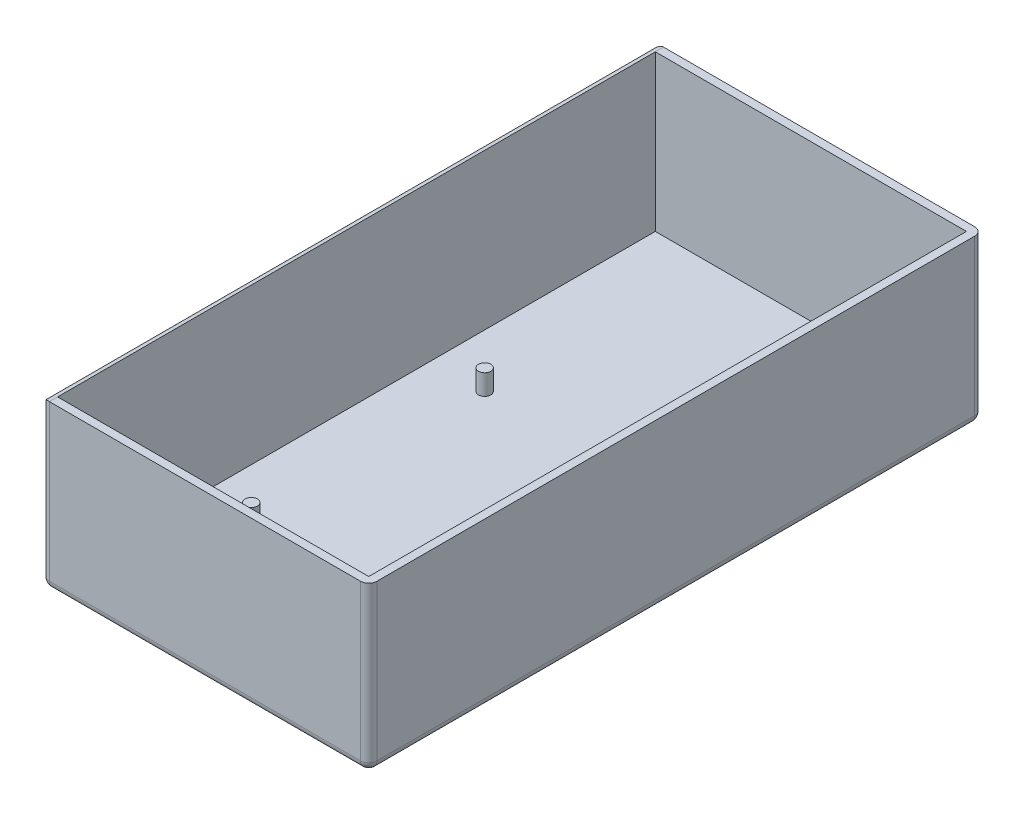
ISO-10303-21;
HEADER;
FILE_DESCRIPTION(('STEP AP214'),'2;1');
FILE_NAME('part.step','',(''),(''),'','','');
FILE_SCHEMA(('AUTOMOTIVE_DESIGN { 1 0 10303 214 1 1 1 1 }'));
ENDSEC;
DATA;
#1=APPLICATION_CONTEXT('core data for automotive mechanical design processes');
#2=APPLICATION_PROTOCOL_DEFINITION('international standard','automotive_design',2000,#1);
#3=PRODUCT_CONTEXT('',#1,'mechanical');
#4=PRODUCT('Part','Part','',(#3));
#5=PRODUCT_RELATED_PRODUCT_CATEGORY('part','',(#4));
#6=PRODUCT_DEFINITION_FORMATION('','',#4);
#7=PRODUCT_DEFINITION_CONTEXT('part definition',#1,'design');
#8=PRODUCT_DEFINITION('design','',#6,#7);
#9=PRODUCT_DEFINITION_SHAPE('','',#8);
#10=(LENGTH_UNIT() NAMED_UNIT(*) SI_UNIT(.MILLI.,.METRE.));
#11=(NAMED_UNIT(*) PLANE_ANGLE_UNIT() SI_UNIT($,.RADIAN.));
#12=(NAMED_UNIT(*) SI_UNIT($,.STERADIAN.) SOLID_ANGLE_UNIT());
#13=UNCERTAINTY_MEASURE_WITH_UNIT(LENGTH_MEASURE(1.E-05),#10,'distance_accuracy_value','');
#14=(GEOMETRIC_REPRESENTATION_CONTEXT(3) GLOBAL_UNCERTAINTY_ASSIGNED_CONTEXT((#13)) GLOBAL_UNIT_ASSIGNED_CONTEXT((#10,
#11,#12)) REPRESENTATION_CONTEXT('',''));
#15=CARTESIAN_POINT('',(0.,0.,0.));
#16=DIRECTION('',(0.,0.,1.));
#17=DIRECTION('',(1.,0.,0.));
#18=AXIS2_PLACEMENT_3D('',#15,#16,#17);
#19=CARTESIAN_POINT('',(-48.8659203302278,40.,-116.755152562222));
#20=DIRECTION('',(1.,0.,0.));
#21=DIRECTION('',(0.,0.,-1.));
#22=AXIS2_PLACEMENT_3D('',#19,#20,#21);
#23=PLANE('',#22);
#24=DIRECTION('',(0.,-1.,0.));
#25=VECTOR('',#24,1.);
#26=CARTESIAN_POINT('',(-48.8659203302278,40.,31.2448474377779));
#27=LINE('',#26,#25);
#28=CARTESIAN_POINT('',(-48.8659203302278,2.,31.2448474377779));
#29=VERTEX_POINT('',#28);
#30=CARTESIAN_POINT('',(-48.8659203302278,38.,31.2448474377779));
#31=VERTEX_POINT('',#30);
#32=EDGE_CURVE('E219',#29,#31,#27,.F.);
#33=ORIENTED_EDGE('',*,*,#32,.T.);
#34=DIRECTION('',(0.,0.,1.));
#35=VECTOR('',#34,1.);
#36=CARTESIAN_POINT('',(-48.8659203302278,38.,-116.755152562222));
#37=LINE('',#36,#35);
#38=CARTESIAN_POINT('',(-48.8659203302278,38.,-114.755152562222));
#39=VERTEX_POINT('',#38);
#40=EDGE_CURVE('E225',#31,#39,#37,.F.);
#41=ORIENTED_EDGE('',*,*,#40,.T.);
#42=DIRECTION('',(0.,-1.,0.));
#43=VECTOR('',#42,1.);
#44=CARTESIAN_POINT('',(-48.8659203302278,40.,-114.755152562222));
#45=LINE('',#44,#43);
#46=CARTESIAN_POINT('',(-48.8659203302278,2.,-114.755152562222));
#47=VERTEX_POINT('',#46);
#48=EDGE_CURVE('E223',#39,#47,#45,.T.);
#49=ORIENTED_EDGE('',*,*,#48,.T.);
#50=DIRECTION('',(0.,0.,1.));
#51=VECTOR('',#50,1.);
#52=CARTESIAN_POINT('',(-48.8659203302278,2.,-116.755152562222));
#53=LINE('',#52,#51);
#54=EDGE_CURVE('E221',#47,#29,#53,.T.);
#55=ORIENTED_EDGE('',*,*,#54,.T.);
#56=EDGE_LOOP('',(#33,#41,#49,#55));
#57=FACE_BOUND('',#56,.T.);
#58=ADVANCED_FACE('F33',(#57),#23,.F.);
#59=CARTESIAN_POINT('',(-48.8659203302278,40.,33.2448474377779));
#60=DIRECTION('',(0.,0.,-1.));
#61=DIRECTION('',(-1.,0.,0.));
#62=AXIS2_PLACEMENT_3D('',#59,#60,#61);
#63=PLANE('',#62);
#64=DIRECTION('',(1.,0.,0.));
#65=VECTOR('',#64,1.);
#66=CARTESIAN_POINT('',(-48.8659203302278,40.,33.2448474377779));
#67=LINE('',#66,#65);
#68=CARTESIAN_POINT('',(-46.8659203302278,40.,33.2448474377779));
#69=VERTEX_POINT('',#68);
#70=CARTESIAN_POINT('',(29.1340796697722,40.,33.2448474377779));
#71=VERTEX_POINT('',#70);
#72=EDGE_CURVE('E177',#69,#71,#67,.T.);
#73=ORIENTED_EDGE('',*,*,#72,.F.);
#74=DIRECTION('',(0.,-1.,0.));
#75=VECTOR('',#74,1.);
#76=CARTESIAN_POINT('',(-46.8659203302278,40.,33.2448474377779));
#77=LINE('',#76,#75);
#78=CARTESIAN_POINT('',(-46.8659203302278,2.,33.2448474377779));
#79=VERTEX_POINT('',#78);
#80=EDGE_CURVE('E11',#69,#79,#77,.T.);
#81=ORIENTED_EDGE('',*,*,#80,.T.);
#82=DIRECTION('',(1.,0.,0.));
#83=VECTOR('',#82,1.);
#84=CARTESIAN_POINT('',(-48.8659203302278,2.,33.2448474377779));
#85=LINE('',#84,#83);
#86=CARTESIAN_POINT('',(29.1340796697722,2.,33.2448474377779));
#87=VERTEX_POINT('',#86);
#88=EDGE_CURVE('E42',#79,#87,#85,.T.);
#89=ORIENTED_EDGE('',*,*,#88,.T.);
#90=DIRECTION('',(0.,-1.,0.));
#91=VECTOR('',#90,1.);
#92=CARTESIAN_POINT('',(29.1340796697722,40.,33.2448474377779));
#93=LINE('',#92,#91);
#94=EDGE_CURVE('E228',#87,#71,#93,.F.);
#95=ORIENTED_EDGE('',*,*,#94,.T.);
#96=EDGE_LOOP('',(#73,#81,#89,#95));
#97=FACE_BOUND('',#96,.T.);
#98=ADVANCED_FACE('F318',(#97),#63,.F.);
#99=CARTESIAN_POINT('',(31.1340796697722,40.,-116.755152562222));
#100=DIRECTION('',(-1.,0.,0.));
#101=DIRECTION('',(0.,0.,1.));
#102=AXIS2_PLACEMENT_3D('',#99,#100,#101);
#103=PLANE('',#102);
#104=DIRECTION('',(0.,0.,-1.));
#105=VECTOR('',#104,1.);
#106=CARTESIAN_POINT('',(31.1340796697722,2.,-116.755152562222));
#107=LINE('',#106,#105);
#108=CARTESIAN_POINT('',(31.1340796697722,2.,31.2448474377779));
#109=VERTEX_POINT('',#108);
#110=CARTESIAN_POINT('',(31.1340796697722,2.,-114.755152562222));
#111=VERTEX_POINT('',#110);
#112=EDGE_CURVE('E198',#109,#111,#107,.T.);
#113=ORIENTED_EDGE('',*,*,#112,.T.);
#114=DIRECTION('',(0.,-1.,0.));
#115=VECTOR('',#114,1.);
#116=CARTESIAN_POINT('',(31.1340796697722,40.,-114.755152562222));
#117=LINE('',#116,#115);
#118=CARTESIAN_POINT('',(31.1340796697722,40.,-114.755152562222));
#119=VERTEX_POINT('',#118);
#120=EDGE_CURVE('E200',#111,#119,#117,.F.);
#121=ORIENTED_EDGE('',*,*,#120,.T.);
#122=DIRECTION('',(0.,0.,-1.));
#123=VECTOR('',#122,1.);
#124=CARTESIAN_POINT('',(31.1340796697722,40.,-116.755152562222));
#125=LINE('',#124,#123);
#126=CARTESIAN_POINT('',(31.1340796697722,40.,31.2448474377779));
#127=VERTEX_POINT('',#126);
#128=EDGE_CURVE('E183',#127,#119,#125,.T.);
#129=ORIENTED_EDGE('',*,*,#128,.F.);
#130=DIRECTION('',(0.,-1.,0.));
#131=VECTOR('',#130,1.);
#132=CARTESIAN_POINT('',(31.1340796697722,40.,31.2448474377779));
#133=LINE('',#132,#131);
#134=EDGE_CURVE('E196',#127,#109,#133,.T.);
#135=ORIENTED_EDGE('',*,*,#134,.T.);
#136=EDGE_LOOP('',(#113,#121,#129,#135));
#137=FACE_BOUND('',#136,.T.);
#138=ADVANCED_FACE('F325',(#137),#103,.F.);
#139=CARTESIAN_POINT('',(-48.8659203302278,40.,-116.755152562222));
#140=DIRECTION('',(0.,0.,1.));
#141=DIRECTION('',(1.,0.,0.));
#142=AXIS2_PLACEMENT_3D('',#139,#140,#141);
#143=PLANE('',#142);
#144=DIRECTION('',(-1.,0.,0.));
#145=VECTOR('',#144,1.);
#146=CARTESIAN_POINT('',(-48.8659203302278,40.,-116.755152562222));
#147=LINE('',#146,#145);
#148=CARTESIAN_POINT('',(29.1340796697722,40.,-116.755152562222));
#149=VERTEX_POINT('',#148);
#150=CARTESIAN_POINT('',(-46.8659203302278,40.,-116.755152562222));
#151=VERTEX_POINT('',#150);
#152=EDGE_CURVE('E186',#149,#151,#147,.T.);
#153=ORIENTED_EDGE('',*,*,#152,.F.);
#154=DIRECTION('',(0.,-1.,0.));
#155=VECTOR('',#154,1.);
#156=CARTESIAN_POINT('',(29.1340796697722,40.,-116.755152562222));
#157=LINE('',#156,#155);
#158=CARTESIAN_POINT('',(29.1340796697722,2.,-116.755152562222));
#159=VERTEX_POINT('',#158);
#160=EDGE_CURVE('E193',#149,#159,#157,.T.);
#161=ORIENTED_EDGE('',*,*,#160,.T.);
#162=DIRECTION('',(-1.,0.,0.));
#163=VECTOR('',#162,1.);
#164=CARTESIAN_POINT('',(-48.8659203302278,2.,-116.755152562222));
#165=LINE('',#164,#163);
#166=CARTESIAN_POINT('',(-46.8659203302278,2.,-116.755152562222));
#167=VERTEX_POINT('',#166);
#168=EDGE_CURVE('E191',#159,#167,#165,.T.);
#169=ORIENTED_EDGE('',*,*,#168,.T.);
#170=DIRECTION('',(0.,-1.,0.));
#171=VECTOR('',#170,1.);
#172=CARTESIAN_POINT('',(-46.8659203302278,40.,-116.755152562222));
#173=LINE('',#172,#171);
#174=EDGE_CURVE('E189',#167,#151,#173,.F.);
#175=ORIENTED_EDGE('',*,*,#174,.T.);
#176=EDGE_LOOP('',(#153,#161,#169,#175));
#177=FACE_BOUND('',#176,.T.);
#178=ADVANCED_FACE('F399',(#177),#143,.F.);
#179=CARTESIAN_POINT('',(0.,40.,0.));
#180=DIRECTION('',(0.,1.,0.));
#181=DIRECTION('',(0.,0.,1.));
#182=AXIS2_PLACEMENT_3D('',#179,#180,#181);
#183=PLANE('',#182);
#184=ORIENTED_EDGE('',*,*,#128,.T.);
#185=CARTESIAN_POINT('',(29.1340796697722,40.,-114.755152562222));
#186=DIRECTION('',(0.,1.,0.));
#187=DIRECTION('',(0.,0.,1.));
#188=AXIS2_PLACEMENT_3D('',#185,#186,#187);
#189=CIRCLE('',#188,2.);
#190=EDGE_CURVE('E208',#119,#149,#189,.T.);
#191=ORIENTED_EDGE('',*,*,#190,.T.);
#192=ORIENTED_EDGE('',*,*,#152,.T.);
#193=DIRECTION('',(0.,0.,1.));
#194=VECTOR('',#193,1.);
#195=CARTESIAN_POINT('',(-46.8659203302278,40.,33.2448474377779));
#196=LINE('',#195,#194);
#197=CARTESIAN_POINT('',(-46.8659203302278,40.,-114.755152562222));
#198=VERTEX_POINT('',#197);
#199=EDGE_CURVE('E206',#151,#198,#196,.T.);
#200=ORIENTED_EDGE('',*,*,#199,.T.);
#201=DIRECTION('',(-1.,0.,0.));
#202=VECTOR('',#201,1.);
#203=CARTESIAN_POINT('',(-46.8659203302278,40.,-114.755152562222));
#204=LINE('',#203,#202);
#205=CARTESIAN_POINT('',(29.1340796697722,40.,-114.755152562222));
#206=VERTEX_POINT('',#205);
#207=EDGE_CURVE('E170',#206,#198,#204,.T.);
#208=ORIENTED_EDGE('',*,*,#207,.F.);
#209=DIRECTION('',(0.,0.,-1.));
#210=VECTOR('',#209,1.);
#211=CARTESIAN_POINT('',(29.1340796697722,40.,-114.755152562222));
#212=LINE('',#211,#210);
#213=CARTESIAN_POINT('',(29.1340796697722,40.,31.2448474377779));
#214=VERTEX_POINT('',#213);
#215=EDGE_CURVE('E140',#214,#206,#212,.T.);
#216=ORIENTED_EDGE('',*,*,#215,.F.);
#217=DIRECTION('',(1.,0.,0.));
#218=VECTOR('',#217,1.);
#219=CARTESIAN_POINT('',(-46.8659203302278,40.,31.2448474377779));
#220=LINE('',#219,#218);
#221=CARTESIAN_POINT('',(-46.8659203302278,40.,31.2448474377779));
#222=VERTEX_POINT('',#221);
#223=EDGE_CURVE('E158',#222,#214,#220,.T.);
#224=ORIENTED_EDGE('',*,*,#223,.F.);
#225=DIRECTION('',(0.,0.,1.));
#226=VECTOR('',#225,1.);
#227=CARTESIAN_POINT('',(-46.8659203302278,40.,33.2448474377779));
#228=LINE('',#227,#226);
#229=EDGE_CURVE('E204',#222,#69,#228,.T.);
#230=ORIENTED_EDGE('',*,*,#229,.T.);
#231=ORIENTED_EDGE('',*,*,#72,.T.);
#232=CARTESIAN_POINT('',(29.1340796697722,40.,31.2448474377779));
#233=DIRECTION('',(0.,1.,0.));
#234=DIRECTION('',(0.,0.,1.));
#235=AXIS2_PLACEMENT_3D('',#232,#233,#234);
#236=CIRCLE('',#235,2.);
#237=EDGE_CURVE('E202',#71,#127,#236,.T.);
#238=ORIENTED_EDGE('',*,*,#237,.T.);
#239=EDGE_LOOP('',(#184,#191,#192,#200,#208,#216,#224,#230,#231,#238));
#240=FACE_BOUND('',#239,.T.);
#241=ADVANCED_FACE('F384',(#240),#183,.T.);
#242=CARTESIAN_POINT('',(0.,0.,0.));
#243=DIRECTION('',(0.,1.,0.));
#244=DIRECTION('',(0.,0.,1.));
#245=AXIS2_PLACEMENT_3D('',#242,#243,#244);
#246=PLANE('',#245);
#247=DIRECTION('',(-1.,0.,0.));
#248=VECTOR('',#247,1.);
#249=CARTESIAN_POINT('',(0.,0.,-114.755152562222));
#250=LINE('',#249,#248);
#251=CARTESIAN_POINT('',(-46.8659203302278,0.,-114.755152562222));
#252=VERTEX_POINT('',#251);
#253=CARTESIAN_POINT('',(29.1340796697722,0.,-114.755152562222));
#254=VERTEX_POINT('',#253);
#255=EDGE_CURVE('E214',#252,#254,#250,.F.);
#256=ORIENTED_EDGE('',*,*,#255,.T.);
#257=DIRECTION('',(0.,0.,-1.));
#258=VECTOR('',#257,1.);
#259=CARTESIAN_POINT('',(29.1340796697722,0.,0.));
#260=LINE('',#259,#258);
#261=CARTESIAN_POINT('',(29.1340796697722,0.,31.2448474377779));
#262=VERTEX_POINT('',#261);
#263=EDGE_CURVE('E216',#254,#262,#260,.F.);
#264=ORIENTED_EDGE('',*,*,#263,.T.);
#265=DIRECTION('',(1.,0.,0.));
#266=VECTOR('',#265,1.);
#267=CARTESIAN_POINT('',(0.,0.,31.2448474377779));
#268=LINE('',#267,#266);
#269=CARTESIAN_POINT('',(-46.8659203302278,0.,31.2448474377779));
#270=VERTEX_POINT('',#269);
#271=EDGE_CURVE('E210',#262,#270,#268,.F.);
#272=ORIENTED_EDGE('',*,*,#271,.T.);
#273=DIRECTION('',(0.,0.,1.));
#274=VECTOR('',#273,1.);
#275=CARTESIAN_POINT('',(-46.8659203302278,0.,0.));
#276=LINE('',#275,#274);
#277=EDGE_CURVE('E212',#270,#252,#276,.F.);
#278=ORIENTED_EDGE('',*,*,#277,.T.);
#279=EDGE_LOOP('',(#256,#264,#272,#278));
#280=FACE_BOUND('',#279,.T.);
#281=ADVANCED_FACE('F394',(#280),#246,.F.);
#282=CARTESIAN_POINT('',(29.1340796697722,2.,-114.755152562222));
#283=DIRECTION('',(1.,0.,0.));
#284=DIRECTION('',(0.,0.,-1.));
#285=AXIS2_PLACEMENT_3D('',#282,#283,#284);
#286=PLANE('',#285);
#287=ORIENTED_EDGE('',*,*,#215,.T.);
#288=DIRECTION('',(0.,1.,0.));
#289=VECTOR('',#288,1.);
#290=CARTESIAN_POINT('',(29.1340796697722,2.,-114.755152562222));
#291=LINE('',#290,#289);
#292=CARTESIAN_POINT('',(29.1340796697722,2.,-114.755152562222));
#293=VERTEX_POINT('',#292);
#294=EDGE_CURVE('E133',#293,#206,#291,.T.);
#295=ORIENTED_EDGE('',*,*,#294,.F.);
#296=DIRECTION('',(0.,0.,-1.));
#297=VECTOR('',#296,1.);
#298=CARTESIAN_POINT('',(29.1340796697722,2.,-114.755152562222));
#299=LINE('',#298,#297);
#300=CARTESIAN_POINT('',(29.1340796697722,2.,31.2448474377779));
#301=VERTEX_POINT('',#300);
#302=EDGE_CURVE('E137',#301,#293,#299,.T.);
#303=ORIENTED_EDGE('',*,*,#302,.F.);
#304=DIRECTION('',(0.,1.,0.));
#305=VECTOR('',#304,1.);
#306=CARTESIAN_POINT('',(29.1340796697722,2.,31.2448474377779));
#307=LINE('',#306,#305);
#308=EDGE_CURVE('E175',#301,#214,#307,.T.);
#309=ORIENTED_EDGE('',*,*,#308,.T.);
#310=EDGE_LOOP('',(#287,#295,#303,#309));
#311=FACE_BOUND('',#310,.T.);
#312=ADVANCED_FACE('F135',(#311),#286,.F.);
#313=CARTESIAN_POINT('',(-46.8659203302278,2.,31.2448474377779));
#314=DIRECTION('',(0.,0.,1.));
#315=DIRECTION('',(1.,0.,0.));
#316=AXIS2_PLACEMENT_3D('',#313,#314,#315);
#317=PLANE('',#316);
#318=ORIENTED_EDGE('',*,*,#223,.T.);
#319=ORIENTED_EDGE('',*,*,#308,.F.);
#320=DIRECTION('',(1.,0.,0.));
#321=VECTOR('',#320,1.);
#322=CARTESIAN_POINT('',(-46.8659203302278,2.,31.2448474377779));
#323=LINE('',#322,#321);
#324=CARTESIAN_POINT('',(-46.8659203302278,2.,31.2448474377779));
#325=VERTEX_POINT('',#324);
#326=EDGE_CURVE('E145',#325,#301,#323,.T.);
#327=ORIENTED_EDGE('',*,*,#326,.F.);
#328=DIRECTION('',(0.,1.,0.));
#329=VECTOR('',#328,1.);
#330=CARTESIAN_POINT('',(-46.8659203302278,2.,31.2448474377779));
#331=LINE('',#330,#329);
#332=EDGE_CURVE('E178',#325,#222,#331,.T.);
#333=ORIENTED_EDGE('',*,*,#332,.T.);
#334=EDGE_LOOP('',(#318,#319,#327,#333));
#335=FACE_BOUND('',#334,.T.);
#336=ADVANCED_FACE('F386',(#335),#317,.F.);
#337=CARTESIAN_POINT('',(-46.8659203302278,2.,-114.755152562222));
#338=DIRECTION('',(-1.,0.,0.));
#339=DIRECTION('',(0.,0.,1.));
#340=AXIS2_PLACEMENT_3D('',#337,#338,#339);
#341=PLANE('',#340);
#342=DIRECTION('',(0.,0.,1.));
#343=VECTOR('',#342,1.);
#344=CARTESIAN_POINT('',(-46.8659203302278,40.,-114.755152562222));
#345=LINE('',#344,#343);
#346=EDGE_CURVE('E161',#198,#222,#345,.T.);
#347=ORIENTED_EDGE('',*,*,#346,.T.);
#348=ORIENTED_EDGE('',*,*,#332,.F.);
#349=DIRECTION('',(0.,0.,1.));
#350=VECTOR('',#349,1.);
#351=CARTESIAN_POINT('',(-46.8659203302278,2.,-114.755152562222));
#352=LINE('',#351,#350);
#353=CARTESIAN_POINT('',(-46.8659203302278,2.,-114.755152562222));
#354=VERTEX_POINT('',#353);
#355=EDGE_CURVE('E154',#354,#325,#352,.T.);
#356=ORIENTED_EDGE('',*,*,#355,.F.);
#357=DIRECTION('',(0.,1.,0.));
#358=VECTOR('',#357,1.);
#359=CARTESIAN_POINT('',(-46.8659203302278,2.,-114.755152562222));
#360=LINE('',#359,#358);
#361=EDGE_CURVE('E144',#354,#198,#360,.T.);
#362=ORIENTED_EDGE('',*,*,#361,.T.);
#363=EDGE_LOOP('',(#347,#348,#356,#362));
#364=FACE_BOUND('',#363,.T.);
#365=ADVANCED_FACE('F313',(#364),#341,.F.);
#366=CARTESIAN_POINT('',(-46.8659203302278,2.,-114.755152562222));
#367=DIRECTION('',(0.,0.,-1.));
#368=DIRECTION('',(-1.,0.,0.));
#369=AXIS2_PLACEMENT_3D('',#366,#367,#368);
#370=PLANE('',#369);
#371=ORIENTED_EDGE('',*,*,#207,.T.);
#372=ORIENTED_EDGE('',*,*,#361,.F.);
#373=DIRECTION('',(-1.,0.,0.));
#374=VECTOR('',#373,1.);
#375=CARTESIAN_POINT('',(-46.8659203302278,2.,-114.755152562222));
#376=LINE('',#375,#374);
#377=EDGE_CURVE('E148',#293,#354,#376,.T.);
#378=ORIENTED_EDGE('',*,*,#377,.F.);
#379=ORIENTED_EDGE('',*,*,#294,.T.);
#380=EDGE_LOOP('',(#371,#372,#378,#379));
#381=FACE_BOUND('',#380,.T.);
#382=ADVANCED_FACE('F149',(#381),#370,.F.);
#383=CARTESIAN_POINT('',(0.,2.,0.));
#384=DIRECTION('',(0.,1.,0.));
#385=DIRECTION('',(0.,0.,1.));
#386=AXIS2_PLACEMENT_3D('',#383,#384,#385);
#387=PLANE('',#386);
#388=CARTESIAN_POINT('',(-33.8659203302278,2.,-3.07233878495181));
#389=DIRECTION('',(0.,1.,0.));
#390=DIRECTION('',(0.,0.,1.));
#391=AXIS2_PLACEMENT_3D('',#388,#389,#390);
#392=CIRCLE('',#391,1.5);
#393=CARTESIAN_POINT('',(-33.8659203302278,2.,-1.5723387849518));
#394=VERTEX_POINT('',#393);
#395=EDGE_CURVE('E270',#394,#394,#392,.T.);
#396=ORIENTED_EDGE('',*,*,#395,.F.);
#397=EDGE_LOOP('',(#396));
#398=FACE_BOUND('',#397,.T.);
#399=CARTESIAN_POINT('',(16.1340796697722,2.,-3.07233878495181));
#400=DIRECTION('',(0.,1.,0.));
#401=DIRECTION('',(0.,0.,-1.));
#402=AXIS2_PLACEMENT_3D('',#399,#400,#401);
#403=CIRCLE('',#402,1.5);
#404=CARTESIAN_POINT('',(16.1340796697722,2.,-4.57233878495181));
#405=VERTEX_POINT('',#404);
#406=EDGE_CURVE('E281',#405,#405,#403,.T.);
#407=ORIENTED_EDGE('',*,*,#406,.F.);
#408=EDGE_LOOP('',(#407));
#409=FACE_BOUND('',#408,.T.);
#410=CARTESIAN_POINT('',(16.1340796697722,2.,-60.0723387849518));
#411=DIRECTION('',(0.,1.,0.));
#412=DIRECTION('',(0.,0.,-1.));
#413=AXIS2_PLACEMENT_3D('',#410,#411,#412);
#414=CIRCLE('',#413,1.5);
#415=CARTESIAN_POINT('',(16.1340796697722,2.,-61.5723387849518));
#416=VERTEX_POINT('',#415);
#417=EDGE_CURVE('E287',#416,#416,#414,.T.);
#418=ORIENTED_EDGE('',*,*,#417,.F.);
#419=EDGE_LOOP('',(#418));
#420=FACE_BOUND('',#419,.T.);
#421=CARTESIAN_POINT('',(-33.8659203302278,2.,-60.0723387849518));
#422=DIRECTION('',(0.,1.,0.));
#423=DIRECTION('',(0.,0.,1.));
#424=AXIS2_PLACEMENT_3D('',#421,#422,#423);
#425=CIRCLE('',#424,1.5);
#426=CARTESIAN_POINT('',(-33.8659203302278,2.,-58.5723387849518));
#427=VERTEX_POINT('',#426);
#428=EDGE_CURVE('E164',#427,#427,#425,.T.);
#429=ORIENTED_EDGE('',*,*,#428,.F.);
#430=EDGE_LOOP('',(#429));
#431=FACE_BOUND('',#430,.T.);
#432=ORIENTED_EDGE('',*,*,#302,.T.);
#433=ORIENTED_EDGE('',*,*,#377,.T.);
#434=ORIENTED_EDGE('',*,*,#355,.T.);
#435=ORIENTED_EDGE('',*,*,#326,.T.);
#436=EDGE_LOOP('',(#432,#433,#434,#435));
#437=FACE_BOUND('',#436,.T.);
#438=ADVANCED_FACE('F156',(#398,#409,#420,#431,#437),#387,.T.);
#439=CARTESIAN_POINT('',(-33.8659203302278,7.,-60.0723387849518));
#440=DIRECTION('',(0.,-1.,0.));
#441=DIRECTION('',(0.,0.,-1.));
#442=AXIS2_PLACEMENT_3D('',#439,#440,#441);
#443=CYLINDRICAL_SURFACE('',#442,1.5);
#444=CARTESIAN_POINT('',(-33.8659203302278,7.,-60.0723387849518));
#445=DIRECTION('',(0.,1.,0.));
#446=DIRECTION('',(0.,0.,1.));
#447=AXIS2_PLACEMENT_3D('',#444,#445,#446);
#448=CIRCLE('',#447,1.5);
#449=CARTESIAN_POINT('',(-33.8659203302278,7.,-58.5723387849518));
#450=VERTEX_POINT('',#449);
#451=EDGE_CURVE('E171',#450,#450,#448,.T.);
#452=ORIENTED_EDGE('',*,*,#451,.F.);
#453=EDGE_LOOP('',(#452));
#454=FACE_BOUND('',#453,.T.);
#455=ORIENTED_EDGE('',*,*,#428,.T.);
#456=EDGE_LOOP('',(#455));
#457=FACE_BOUND('',#456,.T.);
#458=ADVANCED_FACE('F300',(#454,#457),#443,.T.);
#459=CARTESIAN_POINT('',(-33.8659203302278,7.,-60.0723387849518));
#460=DIRECTION('',(0.,1.,0.));
#461=DIRECTION('',(0.,0.,1.));
#462=AXIS2_PLACEMENT_3D('',#459,#460,#461);
#463=PLANE('',#462);
#464=ORIENTED_EDGE('',*,*,#451,.T.);
#465=EDGE_LOOP('',(#464));
#466=FACE_BOUND('',#465,.T.);
#467=ADVANCED_FACE('F309',(#466),#463,.T.);
#468=CARTESIAN_POINT('',(16.1340796697722,7.,-60.0723387849518));
#469=DIRECTION('',(0.,-1.,0.));
#470=DIRECTION('',(0.,0.,-1.));
#471=AXIS2_PLACEMENT_3D('',#468,#469,#470);
#472=CYLINDRICAL_SURFACE('',#471,1.5);
#473=CARTESIAN_POINT('',(16.1340796697722,7.,-60.0723387849518));
#474=DIRECTION('',(0.,1.,0.));
#475=DIRECTION('',(0.,0.,-1.));
#476=AXIS2_PLACEMENT_3D('',#473,#474,#475);
#477=CIRCLE('',#476,1.5);
#478=CARTESIAN_POINT('',(16.1340796697722,7.,-61.5723387849518));
#479=VERTEX_POINT('',#478);
#480=EDGE_CURVE('E290',#479,#479,#477,.T.);
#481=ORIENTED_EDGE('',*,*,#480,.F.);
#482=EDGE_LOOP('',(#481));
#483=FACE_BOUND('',#482,.T.);
#484=ORIENTED_EDGE('',*,*,#417,.T.);
#485=EDGE_LOOP('',(#484));
#486=FACE_BOUND('',#485,.T.);
#487=ADVANCED_FACE('F582',(#483,#486),#472,.T.);
#488=CARTESIAN_POINT('',(16.1340796697722,7.,-60.0723387849518));
#489=DIRECTION('',(0.,-1.,0.));
#490=DIRECTION('',(0.,0.,-1.));
#491=AXIS2_PLACEMENT_3D('',#488,#489,#490);
#492=PLANE('',#491);
#493=ORIENTED_EDGE('',*,*,#480,.T.);
#494=EDGE_LOOP('',(#493));
#495=FACE_BOUND('',#494,.T.);
#496=ADVANCED_FACE('F574',(#495),#492,.F.);
#497=CARTESIAN_POINT('',(16.1340796697722,7.,-3.07233878495181));
#498=DIRECTION('',(0.,-1.,0.));
#499=DIRECTION('',(0.,0.,-1.));
#500=AXIS2_PLACEMENT_3D('',#497,#498,#499);
#501=CYLINDRICAL_SURFACE('',#500,1.5);
#502=CARTESIAN_POINT('',(16.1340796697722,7.,-3.07233878495181));
#503=DIRECTION('',(0.,1.,0.));
#504=DIRECTION('',(0.,0.,-1.));
#505=AXIS2_PLACEMENT_3D('',#502,#503,#504);
#506=CIRCLE('',#505,1.5);
#507=CARTESIAN_POINT('',(16.1340796697722,7.,-4.57233878495181));
#508=VERTEX_POINT('',#507);
#509=EDGE_CURVE('E284',#508,#508,#506,.T.);
#510=ORIENTED_EDGE('',*,*,#509,.F.);
#511=EDGE_LOOP('',(#510));
#512=FACE_BOUND('',#511,.T.);
#513=ORIENTED_EDGE('',*,*,#406,.T.);
#514=EDGE_LOOP('',(#513));
#515=FACE_BOUND('',#514,.T.);
#516=ADVANCED_FACE('F566',(#512,#515),#501,.T.);
#517=CARTESIAN_POINT('',(16.1340796697722,7.,-3.07233878495181));
#518=DIRECTION('',(0.,-1.,0.));
#519=DIRECTION('',(0.,0.,-1.));
#520=AXIS2_PLACEMENT_3D('',#517,#518,#519);
#521=PLANE('',#520);
#522=ORIENTED_EDGE('',*,*,#509,.T.);
#523=EDGE_LOOP('',(#522));
#524=FACE_BOUND('',#523,.T.);
#525=ADVANCED_FACE('F558',(#524),#521,.F.);
#526=CARTESIAN_POINT('',(-33.8659203302278,7.,-3.07233878495181));
#527=DIRECTION('',(0.,-1.,0.));
#528=DIRECTION('',(0.,0.,-1.));
#529=AXIS2_PLACEMENT_3D('',#526,#527,#528);
#530=CYLINDRICAL_SURFACE('',#529,1.5);
#531=CARTESIAN_POINT('',(-33.8659203302278,7.,-3.07233878495181));
#532=DIRECTION('',(0.,1.,0.));
#533=DIRECTION('',(0.,0.,1.));
#534=AXIS2_PLACEMENT_3D('',#531,#532,#533);
#535=CIRCLE('',#534,1.5);
#536=CARTESIAN_POINT('',(-33.8659203302278,7.,-1.5723387849518));
#537=VERTEX_POINT('',#536);
#538=EDGE_CURVE('E276',#537,#537,#535,.T.);
#539=ORIENTED_EDGE('',*,*,#538,.F.);
#540=EDGE_LOOP('',(#539));
#541=FACE_BOUND('',#540,.T.);
#542=ORIENTED_EDGE('',*,*,#395,.T.);
#543=EDGE_LOOP('',(#542));
#544=FACE_BOUND('',#543,.T.);
#545=ADVANCED_FACE('F551',(#541,#544),#530,.T.);
#546=CARTESIAN_POINT('',(-33.8659203302278,7.,-3.07233878495181));
#547=DIRECTION('',(0.,1.,0.));
#548=DIRECTION('',(0.,0.,1.));
#549=AXIS2_PLACEMENT_3D('',#546,#547,#548);
#550=PLANE('',#549);
#551=ORIENTED_EDGE('',*,*,#538,.T.);
#552=EDGE_LOOP('',(#551));
#553=FACE_BOUND('',#552,.T.);
#554=ADVANCED_FACE('F376',(#553),#550,.T.);
#555=CARTESIAN_POINT('',(-46.8659203302278,40.,31.2448474377779));
#556=DIRECTION('',(0.,-1.,0.));
#557=DIRECTION('',(0.,0.,-1.));
#558=AXIS2_PLACEMENT_3D('',#555,#556,#557);
#559=CYLINDRICAL_SURFACE('',#558,2.);
#560=CARTESIAN_POINT('',(-46.8659203302278,2.,31.2448474377779));
#561=DIRECTION('',(0.,-1.,0.));
#562=DIRECTION('',(0.,0.,-1.));
#563=AXIS2_PLACEMENT_3D('',#560,#561,#562);
#564=CIRCLE('',#563,2.);
#565=EDGE_CURVE('E264',#79,#29,#564,.T.);
#566=ORIENTED_EDGE('',*,*,#565,.F.);
#567=ORIENTED_EDGE('',*,*,#80,.F.);
#568=CARTESIAN_POINT('',(-46.8659203302278,38.,31.2448474377779));
#569=DIRECTION('',(0.,-0.707106781186547,0.707106781186547));
#570=DIRECTION('',(0.,-0.707106781186547,-0.707106781186547));
#571=AXIS2_PLACEMENT_3D('',#568,#569,#570);
#572=ELLIPSE('',#571,2.82842712474619,2.);
#573=EDGE_CURVE('E37',#31,#69,#572,.F.);
#574=ORIENTED_EDGE('',*,*,#573,.F.);
#575=ORIENTED_EDGE('',*,*,#32,.F.);
#576=EDGE_LOOP('',(#566,#567,#574,#575));
#577=FACE_BOUND('',#576,.T.);
#578=ADVANCED_FACE('F35',(#577),#559,.T.);
#579=CARTESIAN_POINT('',(-46.8659203302278,38.,0.));
#580=DIRECTION('',(0.,0.,-1.));
#581=DIRECTION('',(-1.,0.,0.));
#582=AXIS2_PLACEMENT_3D('',#579,#580,#581);
#583=CYLINDRICAL_SURFACE('',#582,2.);
#584=ORIENTED_EDGE('',*,*,#346,.F.);
#585=ORIENTED_EDGE('',*,*,#199,.F.);
#586=CARTESIAN_POINT('',(-46.8659203302278,38.,-114.755152562222));
#587=DIRECTION('',(0.,-0.707106781186547,-0.707106781186547));
#588=DIRECTION('',(0.,-0.707106781186547,0.707106781186547));
#589=AXIS2_PLACEMENT_3D('',#586,#587,#588);
#590=ELLIPSE('',#589,2.82842712474619,2.);
#591=EDGE_CURVE('E262',#39,#151,#590,.T.);
#592=ORIENTED_EDGE('',*,*,#591,.F.);
#593=ORIENTED_EDGE('',*,*,#40,.F.);
#594=ORIENTED_EDGE('',*,*,#573,.T.);
#595=ORIENTED_EDGE('',*,*,#229,.F.);
#596=EDGE_LOOP('',(#584,#585,#592,#593,#594,#595));
#597=FACE_BOUND('',#596,.T.);
#598=ADVANCED_FACE('F371',(#597),#583,.T.);
#599=CARTESIAN_POINT('',(-46.8659203302278,2.,31.2448474377779));
#600=DIRECTION('',(0.,0.,1.));
#601=DIRECTION('',(1.,0.,0.));
#602=AXIS2_PLACEMENT_3D('',#599,#600,#601);
#603=SPHERICAL_SURFACE('',#602,2.);
#604=CARTESIAN_POINT('',(-46.8659203302278,2.,31.2448474377779));
#605=DIRECTION('',(-1.,0.,0.));
#606=DIRECTION('',(0.,0.,1.));
#607=AXIS2_PLACEMENT_3D('',#604,#605,#606);
#608=CIRCLE('',#607,2.);
#609=EDGE_CURVE('E256',#79,#270,#608,.F.);
#610=ORIENTED_EDGE('',*,*,#609,.F.);
#611=ORIENTED_EDGE('',*,*,#565,.T.);
#612=CARTESIAN_POINT('',(-46.8659203302278,2.,31.2448474377779));
#613=DIRECTION('',(0.,0.,1.));
#614=DIRECTION('',(1.,0.,0.));
#615=AXIS2_PLACEMENT_3D('',#612,#613,#614);
#616=CIRCLE('',#615,2.);
#617=EDGE_CURVE('E259',#270,#29,#616,.F.);
#618=ORIENTED_EDGE('',*,*,#617,.F.);
#619=EDGE_LOOP('',(#610,#611,#618));
#620=FACE_BOUND('',#619,.T.);
#621=ADVANCED_FACE('F368',(#620),#603,.T.);
#622=CARTESIAN_POINT('',(-46.8659203302278,40.,-114.755152562222));
#623=DIRECTION('',(0.,-1.,0.));
#624=DIRECTION('',(0.,0.,-1.));
#625=AXIS2_PLACEMENT_3D('',#622,#623,#624);
#626=CYLINDRICAL_SURFACE('',#625,2.);
#627=ORIENTED_EDGE('',*,*,#591,.T.);
#628=ORIENTED_EDGE('',*,*,#174,.F.);
#629=CARTESIAN_POINT('',(-46.8659203302278,2.,-114.755152562222));
#630=DIRECTION('',(0.,-1.,0.));
#631=DIRECTION('',(0.,0.,-1.));
#632=AXIS2_PLACEMENT_3D('',#629,#630,#631);
#633=CIRCLE('',#632,2.);
#634=EDGE_CURVE('E253',#47,#167,#633,.T.);
#635=ORIENTED_EDGE('',*,*,#634,.F.);
#636=ORIENTED_EDGE('',*,*,#48,.F.);
#637=EDGE_LOOP('',(#627,#628,#635,#636));
#638=FACE_BOUND('',#637,.T.);
#639=ADVANCED_FACE('F364',(#638),#626,.T.);
#640=CARTESIAN_POINT('',(-46.8659203302278,2.,-116.755152562222));
#641=DIRECTION('',(0.,0.,1.));
#642=DIRECTION('',(1.,0.,0.));
#643=AXIS2_PLACEMENT_3D('',#640,#641,#642);
#644=CYLINDRICAL_SURFACE('',#643,2.);
#645=ORIENTED_EDGE('',*,*,#617,.T.);
#646=ORIENTED_EDGE('',*,*,#54,.F.);
#647=CARTESIAN_POINT('',(-46.8659203302278,2.,-114.755152562222));
#648=DIRECTION('',(0.,0.,-1.));
#649=DIRECTION('',(-1.,0.,0.));
#650=AXIS2_PLACEMENT_3D('',#647,#648,#649);
#651=CIRCLE('',#650,2.);
#652=EDGE_CURVE('E250',#252,#47,#651,.T.);
#653=ORIENTED_EDGE('',*,*,#652,.F.);
#654=ORIENTED_EDGE('',*,*,#277,.F.);
#655=EDGE_LOOP('',(#645,#646,#653,#654));
#656=FACE_BOUND('',#655,.T.);
#657=ADVANCED_FACE('F360',(#656),#644,.T.);
#658=CARTESIAN_POINT('',(-48.8659203302278,2.,31.2448474377779));
#659=DIRECTION('',(1.,0.,0.));
#660=DIRECTION('',(0.,0.,-1.));
#661=AXIS2_PLACEMENT_3D('',#658,#659,#660);
#662=CYLINDRICAL_SURFACE('',#661,2.);
#663=ORIENTED_EDGE('',*,*,#609,.T.);
#664=ORIENTED_EDGE('',*,*,#271,.F.);
#665=CARTESIAN_POINT('',(29.1340796697722,2.,31.2448474377779));
#666=DIRECTION('',(1.,0.,0.));
#667=DIRECTION('',(0.,0.,-1.));
#668=AXIS2_PLACEMENT_3D('',#665,#666,#667);
#669=CIRCLE('',#668,2.);
#670=EDGE_CURVE('E247',#87,#262,#669,.T.);
#671=ORIENTED_EDGE('',*,*,#670,.F.);
#672=ORIENTED_EDGE('',*,*,#88,.F.);
#673=EDGE_LOOP('',(#663,#664,#671,#672));
#674=FACE_BOUND('',#673,.T.);
#675=ADVANCED_FACE('F356',(#674),#662,.T.);
#676=CARTESIAN_POINT('',(29.1340796697722,40.,31.2448474377779));
#677=DIRECTION('',(0.,-1.,0.));
#678=DIRECTION('',(0.,0.,-1.));
#679=AXIS2_PLACEMENT_3D('',#676,#677,#678);
#680=CYLINDRICAL_SURFACE('',#679,2.);
#681=ORIENTED_EDGE('',*,*,#237,.F.);
#682=ORIENTED_EDGE('',*,*,#94,.F.);
#683=CARTESIAN_POINT('',(29.1340796697722,2.,31.2448474377779));
#684=DIRECTION('',(0.,-1.,0.));
#685=DIRECTION('',(0.,0.,-1.));
#686=AXIS2_PLACEMENT_3D('',#683,#684,#685);
#687=CIRCLE('',#686,2.);
#688=EDGE_CURVE('E244',#109,#87,#687,.T.);
#689=ORIENTED_EDGE('',*,*,#688,.F.);
#690=ORIENTED_EDGE('',*,*,#134,.F.);
#691=EDGE_LOOP('',(#681,#682,#689,#690));
#692=FACE_BOUND('',#691,.T.);
#693=ADVANCED_FACE('F352',(#692),#680,.T.);
#694=CARTESIAN_POINT('',(-46.8659203302278,2.,-114.755152562222));
#695=DIRECTION('',(0.,0.,1.));
#696=DIRECTION('',(1.,0.,0.));
#697=AXIS2_PLACEMENT_3D('',#694,#695,#696);
#698=SPHERICAL_SURFACE('',#697,2.);
#699=ORIENTED_EDGE('',*,*,#652,.T.);
#700=ORIENTED_EDGE('',*,*,#634,.T.);
#701=CARTESIAN_POINT('',(-46.8659203302278,2.,-114.755152562222));
#702=DIRECTION('',(-1.,0.,0.));
#703=DIRECTION('',(0.,0.,1.));
#704=AXIS2_PLACEMENT_3D('',#701,#702,#703);
#705=CIRCLE('',#704,2.);
#706=EDGE_CURVE('E241',#252,#167,#705,.F.);
#707=ORIENTED_EDGE('',*,*,#706,.F.);
#708=EDGE_LOOP('',(#699,#700,#707));
#709=FACE_BOUND('',#708,.T.);
#710=ADVANCED_FACE('F348',(#709),#698,.T.);
#711=CARTESIAN_POINT('',(29.1340796697722,2.,31.2448474377779));
#712=DIRECTION('',(0.,0.,1.));
#713=DIRECTION('',(1.,0.,0.));
#714=AXIS2_PLACEMENT_3D('',#711,#712,#713);
#715=SPHERICAL_SURFACE('',#714,2.);
#716=ORIENTED_EDGE('',*,*,#688,.T.);
#717=ORIENTED_EDGE('',*,*,#670,.T.);
#718=CARTESIAN_POINT('',(29.1340796697722,2.,31.2448474377779));
#719=DIRECTION('',(0.,0.,1.));
#720=DIRECTION('',(1.,0.,0.));
#721=AXIS2_PLACEMENT_3D('',#718,#719,#720);
#722=CIRCLE('',#721,2.);
#723=EDGE_CURVE('E239',#109,#262,#722,.F.);
#724=ORIENTED_EDGE('',*,*,#723,.F.);
#725=EDGE_LOOP('',(#716,#717,#724));
#726=FACE_BOUND('',#725,.T.);
#727=ADVANCED_FACE('F344',(#726),#715,.T.);
#728=CARTESIAN_POINT('',(-48.8659203302278,2.,-114.755152562222));
#729=DIRECTION('',(-1.,0.,0.));
#730=DIRECTION('',(0.,0.,1.));
#731=AXIS2_PLACEMENT_3D('',#728,#729,#730);
#732=CYLINDRICAL_SURFACE('',#731,2.);
#733=ORIENTED_EDGE('',*,*,#706,.T.);
#734=ORIENTED_EDGE('',*,*,#168,.F.);
#735=CARTESIAN_POINT('',(29.1340796697722,2.,-114.755152562222));
#736=DIRECTION('',(1.,0.,0.));
#737=DIRECTION('',(0.,0.,-1.));
#738=AXIS2_PLACEMENT_3D('',#735,#736,#737);
#739=CIRCLE('',#738,2.);
#740=EDGE_CURVE('E236',#254,#159,#739,.T.);
#741=ORIENTED_EDGE('',*,*,#740,.F.);
#742=ORIENTED_EDGE('',*,*,#255,.F.);
#743=EDGE_LOOP('',(#733,#734,#741,#742));
#744=FACE_BOUND('',#743,.T.);
#745=ADVANCED_FACE('F340',(#744),#732,.T.);
#746=CARTESIAN_POINT('',(29.1340796697722,2.,-116.755152562222));
#747=DIRECTION('',(0.,0.,-1.));
#748=DIRECTION('',(-1.,0.,0.));
#749=AXIS2_PLACEMENT_3D('',#746,#747,#748);
#750=CYLINDRICAL_SURFACE('',#749,2.);
#751=ORIENTED_EDGE('',*,*,#723,.T.);
#752=ORIENTED_EDGE('',*,*,#263,.F.);
#753=CARTESIAN_POINT('',(29.1340796697722,2.,-114.755152562222));
#754=DIRECTION('',(0.,0.,-1.));
#755=DIRECTION('',(-1.,0.,0.));
#756=AXIS2_PLACEMENT_3D('',#753,#754,#755);
#757=CIRCLE('',#756,2.);
#758=EDGE_CURVE('E233',#111,#254,#757,.T.);
#759=ORIENTED_EDGE('',*,*,#758,.F.);
#760=ORIENTED_EDGE('',*,*,#112,.F.);
#761=EDGE_LOOP('',(#751,#752,#759,#760));
#762=FACE_BOUND('',#761,.T.);
#763=ADVANCED_FACE('F336',(#762),#750,.T.);
#764=CARTESIAN_POINT('',(29.1340796697722,2.,-114.755152562222));
#765=DIRECTION('',(0.,0.,1.));
#766=DIRECTION('',(1.,0.,0.));
#767=AXIS2_PLACEMENT_3D('',#764,#765,#766);
#768=SPHERICAL_SURFACE('',#767,2.);
#769=ORIENTED_EDGE('',*,*,#758,.T.);
#770=ORIENTED_EDGE('',*,*,#740,.T.);
#771=CARTESIAN_POINT('',(29.1340796697722,2.,-114.755152562222));
#772=DIRECTION('',(0.,-1.,0.));
#773=DIRECTION('',(0.,0.,-1.));
#774=AXIS2_PLACEMENT_3D('',#771,#772,#773);
#775=CIRCLE('',#774,2.);
#776=EDGE_CURVE('E231',#111,#159,#775,.F.);
#777=ORIENTED_EDGE('',*,*,#776,.F.);
#778=EDGE_LOOP('',(#769,#770,#777));
#779=FACE_BOUND('',#778,.T.);
#780=ADVANCED_FACE('F332',(#779),#768,.T.);
#781=CARTESIAN_POINT('',(29.1340796697722,40.,-114.755152562222));
#782=DIRECTION('',(0.,-1.,0.));
#783=DIRECTION('',(0.,0.,-1.));
#784=AXIS2_PLACEMENT_3D('',#781,#782,#783);
#785=CYLINDRICAL_SURFACE('',#784,2.);
#786=ORIENTED_EDGE('',*,*,#190,.F.);
#787=ORIENTED_EDGE('',*,*,#120,.F.);
#788=ORIENTED_EDGE('',*,*,#776,.T.);
#789=ORIENTED_EDGE('',*,*,#160,.F.);
#790=EDGE_LOOP('',(#786,#787,#788,#789));
#791=FACE_BOUND('',#790,.T.);
#792=ADVANCED_FACE('F329',(#791),#785,.T.);
#793=CLOSED_SHELL('',(#58,#98,#138,#178,#241,#281,#312,#336,#365,#382,#438,#458,#467,#487,#496,
#516,#525,#545,#554,#578,#598,#621,#639,#657,#675,#693,#710,#727,#745,#763,#780,#792));
#794=MANIFOLD_SOLID_BREP('B2',#793);
#795=ADVANCED_BREP_SHAPE_REPRESENTATION('',(#18,#794),#14);
#796=SHAPE_DEFINITION_REPRESENTATION(#9,#795);
ENDSEC;
END-ISO-10303-21;
